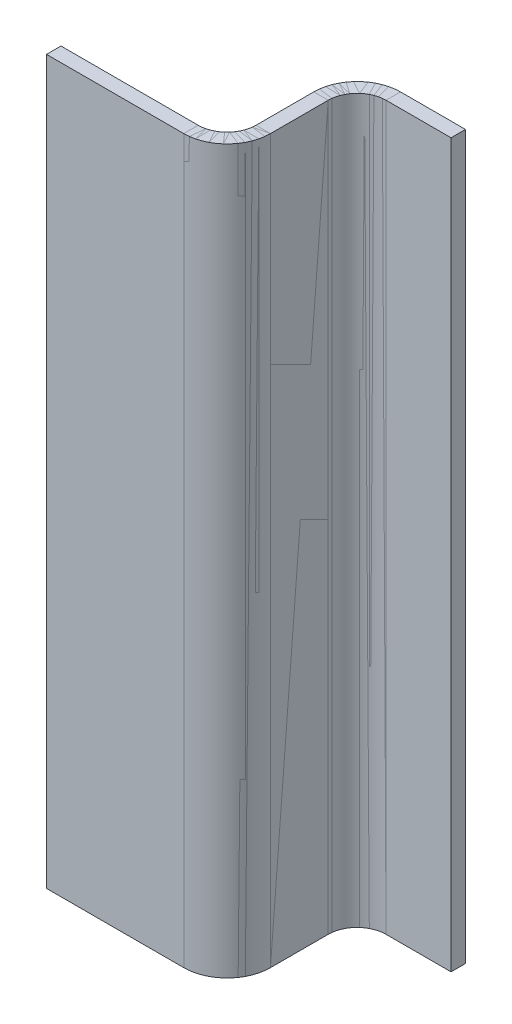
ISO-10303-21;
HEADER;
FILE_DESCRIPTION(('STEP AP214'),'2;1');
FILE_NAME('part.step','',(''),(''),'','','');
FILE_SCHEMA(('AUTOMOTIVE_DESIGN { 1 0 10303 214 1 1 1 1 }'));
ENDSEC;
DATA;
#1=APPLICATION_CONTEXT('core data for automotive mechanical design processes');
#2=APPLICATION_PROTOCOL_DEFINITION('international standard','automotive_design',2000,#1);
#3=PRODUCT_CONTEXT('',#1,'mechanical');
#4=PRODUCT('Part','Part','',(#3));
#5=PRODUCT_RELATED_PRODUCT_CATEGORY('part','',(#4));
#6=PRODUCT_DEFINITION_FORMATION('','',#4);
#7=PRODUCT_DEFINITION_CONTEXT('part definition',#1,'design');
#8=PRODUCT_DEFINITION('design','',#6,#7);
#9=PRODUCT_DEFINITION_SHAPE('','',#8);
#10=(LENGTH_UNIT() NAMED_UNIT(*) SI_UNIT(.MILLI.,.METRE.));
#11=(NAMED_UNIT(*) PLANE_ANGLE_UNIT() SI_UNIT($,.RADIAN.));
#12=(NAMED_UNIT(*) SI_UNIT($,.STERADIAN.) SOLID_ANGLE_UNIT());
#13=UNCERTAINTY_MEASURE_WITH_UNIT(LENGTH_MEASURE(1.E-05),#10,'distance_accuracy_value','');
#14=(GEOMETRIC_REPRESENTATION_CONTEXT(3) GLOBAL_UNCERTAINTY_ASSIGNED_CONTEXT((#13)) GLOBAL_UNIT_ASSIGNED_CONTEXT((#10,
#11,#12)) REPRESENTATION_CONTEXT('',''));
#15=CARTESIAN_POINT('',(0.,0.,0.));
#16=DIRECTION('',(0.,0.,1.));
#17=DIRECTION('',(1.,0.,0.));
#18=AXIS2_PLACEMENT_3D('',#15,#16,#17);
#19=CARTESIAN_POINT('',(19.,49.9999999999999,-5.));
#20=DIRECTION('',(0.,-1.,0.));
#21=DIRECTION('',(0.,0.,-1.));
#22=AXIS2_PLACEMENT_3D('',#19,#20,#21);
#23=PLANE('',#22);
#24=DIRECTION('',(1.,0.,0.));
#25=VECTOR('',#24,1.);
#26=CARTESIAN_POINT('',(25.,49.9999999999999,-5.00000000000002));
#27=LINE('',#26,#25);
#28=CARTESIAN_POINT('',(23.,49.9999999999999,-5.00000000000001));
#29=VERTEX_POINT('',#28);
#30=CARTESIAN_POINT('',(25.,49.9999999999999,-5.00000000000002));
#31=VERTEX_POINT('',#30);
#32=EDGE_CURVE('E12',#29,#31,#27,.T.);
#33=ORIENTED_EDGE('',*,*,#32,.F.);
#34=CARTESIAN_POINT('',(19.,49.9999999999999,-5.));
#35=DIRECTION('',(0.,1.,0.));
#36=DIRECTION('',(0.,0.,1.));
#37=AXIS2_PLACEMENT_3D('',#34,#35,#36);
#38=CIRCLE('',#37,4.);
#39=CARTESIAN_POINT('',(19.,49.9999999999999,-0.999999999999996));
#40=VERTEX_POINT('',#39);
#41=EDGE_CURVE('E176',#40,#29,#38,.T.);
#42=ORIENTED_EDGE('',*,*,#41,.F.);
#43=DIRECTION('',(0.,0.,1.));
#44=VECTOR('',#43,1.);
#45=CARTESIAN_POINT('',(19.,49.9999999999999,1.));
#46=LINE('',#45,#44);
#47=CARTESIAN_POINT('',(19.,49.9999999999999,1.));
#48=VERTEX_POINT('',#47);
#49=EDGE_CURVE('E65',#40,#48,#46,.T.);
#50=ORIENTED_EDGE('',*,*,#49,.T.);
#51=CARTESIAN_POINT('',(19.,49.9999999999999,-5.));
#52=DIRECTION('',(0.,1.,0.));
#53=DIRECTION('',(0.,0.,1.));
#54=AXIS2_PLACEMENT_3D('',#51,#52,#53);
#55=CIRCLE('',#54,6.);
#56=EDGE_CURVE('E213',#48,#31,#55,.T.);
#57=ORIENTED_EDGE('',*,*,#56,.T.);
#58=EDGE_LOOP('',(#33,#42,#50,#57));
#59=FACE_BOUND('',#58,.T.);
#60=ADVANCED_FACE('F55',(#59),#23,.F.);
#61=CARTESIAN_POINT('',(0.,49.9999999999999,1.));
#62=DIRECTION('',(0.,-1.,0.));
#63=DIRECTION('',(1.,0.,0.));
#64=AXIS2_PLACEMENT_3D('',#61,#62,#63);
#65=PLANE('',#64);
#66=ORIENTED_EDGE('',*,*,#49,.F.);
#67=DIRECTION('',(1.,0.,0.));
#68=VECTOR('',#67,1.);
#69=CARTESIAN_POINT('',(0.,49.9999999999999,-0.999999999999995));
#70=LINE('',#69,#68);
#71=CARTESIAN_POINT('',(0.,49.9999999999999,-0.999999999999995));
#72=VERTEX_POINT('',#71);
#73=EDGE_CURVE('E183',#72,#40,#70,.T.);
#74=ORIENTED_EDGE('',*,*,#73,.F.);
#75=DIRECTION('',(0.,0.,1.));
#76=VECTOR('',#75,1.);
#77=CARTESIAN_POINT('',(0.,49.9999999999999,1.));
#78=LINE('',#77,#76);
#79=CARTESIAN_POINT('',(0.,49.9999999999999,1.));
#80=VERTEX_POINT('',#79);
#81=EDGE_CURVE('E206',#72,#80,#78,.T.);
#82=ORIENTED_EDGE('',*,*,#81,.T.);
#83=DIRECTION('',(1.,0.,0.));
#84=VECTOR('',#83,1.);
#85=CARTESIAN_POINT('',(0.,49.9999999999999,1.));
#86=LINE('',#85,#84);
#87=EDGE_CURVE('E235',#80,#48,#86,.T.);
#88=ORIENTED_EDGE('',*,*,#87,.T.);
#89=EDGE_LOOP('',(#66,#74,#82,#88));
#90=FACE_BOUND('',#89,.T.);
#91=ADVANCED_FACE('F236',(#90),#65,.F.);
#92=CARTESIAN_POINT('',(0.,-50.0000000000001,1.00000000000001));
#93=DIRECTION('',(-1.,0.,0.));
#94=DIRECTION('',(0.,-1.,0.));
#95=AXIS2_PLACEMENT_3D('',#92,#93,#94);
#96=PLANE('',#95);
#97=ORIENTED_EDGE('',*,*,#81,.F.);
#98=DIRECTION('',(0.,1.,0.));
#99=VECTOR('',#98,1.);
#100=CARTESIAN_POINT('',(0.,-50.0000000000001,-0.999999999999991));
#101=LINE('',#100,#99);
#102=CARTESIAN_POINT('',(0.,-50.0000000000001,-0.999999999999991));
#103=VERTEX_POINT('',#102);
#104=EDGE_CURVE('E180',#72,#103,#101,.F.);
#105=ORIENTED_EDGE('',*,*,#104,.T.);
#106=DIRECTION('',(0.,0.,1.));
#107=VECTOR('',#106,1.);
#108=CARTESIAN_POINT('',(0.,-50.0000000000001,1.00000000000001));
#109=LINE('',#108,#107);
#110=CARTESIAN_POINT('',(0.,-50.0000000000001,1.00000000000001));
#111=VERTEX_POINT('',#110);
#112=EDGE_CURVE('E203',#103,#111,#109,.T.);
#113=ORIENTED_EDGE('',*,*,#112,.T.);
#114=DIRECTION('',(0.,-1.,0.));
#115=VECTOR('',#114,1.);
#116=CARTESIAN_POINT('',(0.,-50.0000000000001,1.00000000000001));
#117=LINE('',#116,#115);
#118=EDGE_CURVE('E240',#80,#111,#117,.T.);
#119=ORIENTED_EDGE('',*,*,#118,.F.);
#120=EDGE_LOOP('',(#97,#105,#113,#119));
#121=FACE_BOUND('',#120,.T.);
#122=ADVANCED_FACE('F284',(#121),#96,.T.);
#123=CARTESIAN_POINT('',(0.,-50.0000000000001,1.00000000000001));
#124=DIRECTION('',(0.,-1.,0.));
#125=DIRECTION('',(1.,0.,0.));
#126=AXIS2_PLACEMENT_3D('',#123,#124,#125);
#127=PLANE('',#126);
#128=ORIENTED_EDGE('',*,*,#112,.F.);
#129=DIRECTION('',(1.,0.,0.));
#130=VECTOR('',#129,1.);
#131=CARTESIAN_POINT('',(0.,-50.0000000000001,-0.999999999999991));
#132=LINE('',#131,#130);
#133=CARTESIAN_POINT('',(19.,-50.0000000000001,-0.999999999999993));
#134=VERTEX_POINT('',#133);
#135=EDGE_CURVE('E177',#103,#134,#132,.T.);
#136=ORIENTED_EDGE('',*,*,#135,.T.);
#137=DIRECTION('',(0.,0.,1.));
#138=VECTOR('',#137,1.);
#139=CARTESIAN_POINT('',(19.,-50.0000000000001,1.));
#140=LINE('',#139,#138);
#141=CARTESIAN_POINT('',(19.,-50.0000000000001,1.));
#142=VERTEX_POINT('',#141);
#143=EDGE_CURVE('E200',#134,#142,#140,.T.);
#144=ORIENTED_EDGE('',*,*,#143,.T.);
#145=DIRECTION('',(1.,0.,0.));
#146=VECTOR('',#145,1.);
#147=CARTESIAN_POINT('',(0.,-50.0000000000001,1.00000000000001));
#148=LINE('',#147,#146);
#149=EDGE_CURVE('E232',#111,#142,#148,.T.);
#150=ORIENTED_EDGE('',*,*,#149,.F.);
#151=EDGE_LOOP('',(#128,#136,#144,#150));
#152=FACE_BOUND('',#151,.T.);
#153=ADVANCED_FACE('F288',(#152),#127,.T.);
#154=CARTESIAN_POINT('',(19.,-50.0000000000001,-5.));
#155=DIRECTION('',(0.,-1.,0.));
#156=DIRECTION('',(0.,0.,-1.));
#157=AXIS2_PLACEMENT_3D('',#154,#155,#156);
#158=PLANE('',#157);
#159=ORIENTED_EDGE('',*,*,#143,.F.);
#160=CARTESIAN_POINT('',(19.,-50.0000000000001,-5.));
#161=DIRECTION('',(0.,1.,0.));
#162=DIRECTION('',(0.,0.,1.));
#163=AXIS2_PLACEMENT_3D('',#160,#161,#162);
#164=CIRCLE('',#163,4.);
#165=CARTESIAN_POINT('',(23.,-50.0000000000001,-5.00000000000001));
#166=VERTEX_POINT('',#165);
#167=EDGE_CURVE('E170',#134,#166,#164,.T.);
#168=ORIENTED_EDGE('',*,*,#167,.T.);
#169=DIRECTION('',(1.,0.,0.));
#170=VECTOR('',#169,1.);
#171=CARTESIAN_POINT('',(25.,-50.0000000000001,-5.00000000000002));
#172=LINE('',#171,#170);
#173=CARTESIAN_POINT('',(25.,-50.0000000000001,-5.00000000000002));
#174=VERTEX_POINT('',#173);
#175=EDGE_CURVE('E197',#166,#174,#172,.T.);
#176=ORIENTED_EDGE('',*,*,#175,.T.);
#177=CARTESIAN_POINT('',(19.,-50.0000000000001,-5.));
#178=DIRECTION('',(0.,1.,0.));
#179=DIRECTION('',(0.,0.,1.));
#180=AXIS2_PLACEMENT_3D('',#177,#178,#179);
#181=CIRCLE('',#180,6.);
#182=EDGE_CURVE('E231',#142,#174,#181,.T.);
#183=ORIENTED_EDGE('',*,*,#182,.F.);
#184=EDGE_LOOP('',(#159,#168,#176,#183));
#185=FACE_BOUND('',#184,.T.);
#186=ADVANCED_FACE('F275',(#185),#158,.T.);
#187=CARTESIAN_POINT('',(25.,-50.0000000000001,-5.00000000000002));
#188=DIRECTION('',(0.,-1.,0.));
#189=DIRECTION('',(0.,0.,-1.));
#190=AXIS2_PLACEMENT_3D('',#187,#188,#189);
#191=PLANE('',#190);
#192=ORIENTED_EDGE('',*,*,#175,.F.);
#193=DIRECTION('',(0.,0.,-1.));
#194=VECTOR('',#193,1.);
#195=CARTESIAN_POINT('',(23.,-50.0000000000001,-5.00000000000001));
#196=LINE('',#195,#194);
#197=CARTESIAN_POINT('',(23.,-50.0000000000001,-13.));
#198=VERTEX_POINT('',#197);
#199=EDGE_CURVE('E172',#166,#198,#196,.T.);
#200=ORIENTED_EDGE('',*,*,#199,.T.);
#201=DIRECTION('',(1.,0.,0.));
#202=VECTOR('',#201,1.);
#203=CARTESIAN_POINT('',(25.,-50.0000000000001,-13.));
#204=LINE('',#203,#202);
#205=CARTESIAN_POINT('',(25.,-50.0000000000001,-13.));
#206=VERTEX_POINT('',#205);
#207=EDGE_CURVE('E194',#198,#206,#204,.T.);
#208=ORIENTED_EDGE('',*,*,#207,.T.);
#209=DIRECTION('',(0.,0.,-1.));
#210=VECTOR('',#209,1.);
#211=CARTESIAN_POINT('',(25.,-50.0000000000001,-5.00000000000002));
#212=LINE('',#211,#210);
#213=EDGE_CURVE('E246',#174,#206,#212,.T.);
#214=ORIENTED_EDGE('',*,*,#213,.F.);
#215=EDGE_LOOP('',(#192,#200,#208,#214));
#216=FACE_BOUND('',#215,.T.);
#217=ADVANCED_FACE('F295',(#216),#191,.T.);
#218=CARTESIAN_POINT('',(29.,-50.0000000000001,-13.));
#219=DIRECTION('',(0.,1.,0.));
#220=DIRECTION('',(0.,0.,1.));
#221=AXIS2_PLACEMENT_3D('',#218,#219,#220);
#222=PLANE('',#221);
#223=ORIENTED_EDGE('',*,*,#207,.F.);
#224=CARTESIAN_POINT('',(29.,-50.0000000000001,-13.));
#225=DIRECTION('',(0.,-1.,0.));
#226=DIRECTION('',(0.,0.,-1.));
#227=AXIS2_PLACEMENT_3D('',#224,#225,#226);
#228=CIRCLE('',#227,6.);
#229=CARTESIAN_POINT('',(29.,-50.0000000000001,-19.));
#230=VERTEX_POINT('',#229);
#231=EDGE_CURVE('E142',#198,#230,#228,.T.);
#232=ORIENTED_EDGE('',*,*,#231,.T.);
#233=DIRECTION('',(0.,0.,1.));
#234=VECTOR('',#233,1.);
#235=CARTESIAN_POINT('',(29.,-50.0000000000001,-17.));
#236=LINE('',#235,#234);
#237=CARTESIAN_POINT('',(29.,-50.0000000000001,-17.));
#238=VERTEX_POINT('',#237);
#239=EDGE_CURVE('E192',#230,#238,#236,.T.);
#240=ORIENTED_EDGE('',*,*,#239,.T.);
#241=CARTESIAN_POINT('',(29.,-50.0000000000001,-13.));
#242=DIRECTION('',(0.,-1.,0.));
#243=DIRECTION('',(-1.,0.,0.));
#244=AXIS2_PLACEMENT_3D('',#241,#242,#243);
#245=CIRCLE('',#244,4.);
#246=EDGE_CURVE('E131',#206,#238,#245,.T.);
#247=ORIENTED_EDGE('',*,*,#246,.F.);
#248=EDGE_LOOP('',(#223,#232,#240,#247));
#249=FACE_BOUND('',#248,.T.);
#250=ADVANCED_FACE('F337',(#249),#222,.F.);
#251=CARTESIAN_POINT('',(29.,-50.0000000000001,-17.));
#252=DIRECTION('',(0.,-1.,0.));
#253=DIRECTION('',(1.,0.,0.));
#254=AXIS2_PLACEMENT_3D('',#251,#252,#253);
#255=PLANE('',#254);
#256=ORIENTED_EDGE('',*,*,#239,.F.);
#257=DIRECTION('',(1.,0.,0.));
#258=VECTOR('',#257,1.);
#259=CARTESIAN_POINT('',(29.,-50.0000000000001,-19.));
#260=LINE('',#259,#258);
#261=CARTESIAN_POINT('',(37.9999999999999,-50.0000000000001,-19.));
#262=VERTEX_POINT('',#261);
#263=EDGE_CURVE('E155',#230,#262,#260,.T.);
#264=ORIENTED_EDGE('',*,*,#263,.T.);
#265=DIRECTION('',(0.,0.,1.));
#266=VECTOR('',#265,1.);
#267=CARTESIAN_POINT('',(37.9999999999999,-50.0000000000001,-17.));
#268=LINE('',#267,#266);
#269=CARTESIAN_POINT('',(37.9999999999999,-50.0000000000001,-17.));
#270=VERTEX_POINT('',#269);
#271=EDGE_CURVE('E73',#262,#270,#268,.T.);
#272=ORIENTED_EDGE('',*,*,#271,.T.);
#273=DIRECTION('',(1.,0.,0.));
#274=VECTOR('',#273,1.);
#275=CARTESIAN_POINT('',(29.,-50.0000000000001,-17.));
#276=LINE('',#275,#274);
#277=EDGE_CURVE('E264',#238,#270,#276,.T.);
#278=ORIENTED_EDGE('',*,*,#277,.F.);
#279=EDGE_LOOP('',(#256,#264,#272,#278));
#280=FACE_BOUND('',#279,.T.);
#281=ADVANCED_FACE('F348',(#280),#255,.T.);
#282=CARTESIAN_POINT('',(37.9999999999999,-50.0000000000001,-17.));
#283=DIRECTION('',(-1.,0.,0.));
#284=DIRECTION('',(0.,-1.,0.));
#285=AXIS2_PLACEMENT_3D('',#282,#283,#284);
#286=PLANE('',#285);
#287=ORIENTED_EDGE('',*,*,#271,.F.);
#288=DIRECTION('',(0.,1.,0.));
#289=VECTOR('',#288,1.);
#290=CARTESIAN_POINT('',(37.9999999999999,-50.0000000000001,-19.));
#291=LINE('',#290,#289);
#292=CARTESIAN_POINT('',(37.9999999999999,49.9999999999999,-19.));
#293=VERTEX_POINT('',#292);
#294=EDGE_CURVE('E168',#293,#262,#291,.F.);
#295=ORIENTED_EDGE('',*,*,#294,.F.);
#296=DIRECTION('',(0.,0.,1.));
#297=VECTOR('',#296,1.);
#298=CARTESIAN_POINT('',(37.9999999999999,49.9999999999999,-17.));
#299=LINE('',#298,#297);
#300=CARTESIAN_POINT('',(37.9999999999999,49.9999999999999,-17.));
#301=VERTEX_POINT('',#300);
#302=EDGE_CURVE('E188',#293,#301,#299,.T.);
#303=ORIENTED_EDGE('',*,*,#302,.T.);
#304=DIRECTION('',(0.,-1.,0.));
#305=VECTOR('',#304,1.);
#306=CARTESIAN_POINT('',(37.9999999999999,-50.0000000000001,-17.));
#307=LINE('',#306,#305);
#308=EDGE_CURVE('E255',#301,#270,#307,.T.);
#309=ORIENTED_EDGE('',*,*,#308,.T.);
#310=EDGE_LOOP('',(#287,#295,#303,#309));
#311=FACE_BOUND('',#310,.T.);
#312=ADVANCED_FACE('F359',(#311),#286,.F.);
#313=CARTESIAN_POINT('',(29.,49.9999999999999,-17.));
#314=DIRECTION('',(0.,-1.,0.));
#315=DIRECTION('',(1.,0.,0.));
#316=AXIS2_PLACEMENT_3D('',#313,#314,#315);
#317=PLANE('',#316);
#318=ORIENTED_EDGE('',*,*,#302,.F.);
#319=DIRECTION('',(1.,0.,0.));
#320=VECTOR('',#319,1.);
#321=CARTESIAN_POINT('',(29.,49.9999999999999,-19.));
#322=LINE('',#321,#320);
#323=CARTESIAN_POINT('',(29.,49.9999999999999,-19.));
#324=VERTEX_POINT('',#323);
#325=EDGE_CURVE('E165',#324,#293,#322,.T.);
#326=ORIENTED_EDGE('',*,*,#325,.F.);
#327=DIRECTION('',(0.,0.,1.));
#328=VECTOR('',#327,1.);
#329=CARTESIAN_POINT('',(29.,49.9999999999999,-17.));
#330=LINE('',#329,#328);
#331=CARTESIAN_POINT('',(29.,49.9999999999999,-17.));
#332=VERTEX_POINT('',#331);
#333=EDGE_CURVE('E130',#324,#332,#330,.T.);
#334=ORIENTED_EDGE('',*,*,#333,.T.);
#335=DIRECTION('',(1.,0.,0.));
#336=VECTOR('',#335,1.);
#337=CARTESIAN_POINT('',(29.,49.9999999999999,-17.));
#338=LINE('',#337,#336);
#339=EDGE_CURVE('E258',#332,#301,#338,.T.);
#340=ORIENTED_EDGE('',*,*,#339,.T.);
#341=EDGE_LOOP('',(#318,#326,#334,#340));
#342=FACE_BOUND('',#341,.T.);
#343=ADVANCED_FACE('F370',(#342),#317,.F.);
#344=CARTESIAN_POINT('',(29.,49.9999999999999,-13.));
#345=DIRECTION('',(0.,1.,0.));
#346=DIRECTION('',(0.,0.,1.));
#347=AXIS2_PLACEMENT_3D('',#344,#345,#346);
#348=PLANE('',#347);
#349=ORIENTED_EDGE('',*,*,#333,.F.);
#350=CARTESIAN_POINT('',(29.,49.9999999999999,-13.));
#351=DIRECTION('',(0.,-1.,0.));
#352=DIRECTION('',(0.,0.,-1.));
#353=AXIS2_PLACEMENT_3D('',#350,#351,#352);
#354=CIRCLE('',#353,6.);
#355=CARTESIAN_POINT('',(23.,49.9999999999999,-13.));
#356=VERTEX_POINT('',#355);
#357=EDGE_CURVE('E139',#356,#324,#354,.T.);
#358=ORIENTED_EDGE('',*,*,#357,.F.);
#359=DIRECTION('',(1.,0.,0.));
#360=VECTOR('',#359,1.);
#361=CARTESIAN_POINT('',(25.,49.9999999999999,-13.));
#362=LINE('',#361,#360);
#363=CARTESIAN_POINT('',(25.,49.9999999999999,-13.));
#364=VERTEX_POINT('',#363);
#365=EDGE_CURVE('E59',#356,#364,#362,.T.);
#366=ORIENTED_EDGE('',*,*,#365,.T.);
#367=CARTESIAN_POINT('',(29.,49.9999999999999,-13.));
#368=DIRECTION('',(0.,-1.,0.));
#369=DIRECTION('',(-1.,0.,0.));
#370=AXIS2_PLACEMENT_3D('',#367,#368,#369);
#371=CIRCLE('',#370,4.);
#372=EDGE_CURVE('E266',#364,#332,#371,.T.);
#373=ORIENTED_EDGE('',*,*,#372,.T.);
#374=EDGE_LOOP('',(#349,#358,#366,#373));
#375=FACE_BOUND('',#374,.T.);
#376=ADVANCED_FACE('F152',(#375),#348,.T.);
#377=CARTESIAN_POINT('',(25.,49.9999999999999,-5.00000000000002));
#378=DIRECTION('',(0.,-1.,0.));
#379=DIRECTION('',(0.,0.,-1.));
#380=AXIS2_PLACEMENT_3D('',#377,#378,#379);
#381=PLANE('',#380);
#382=DIRECTION('',(0.,0.,-1.));
#383=VECTOR('',#382,1.);
#384=CARTESIAN_POINT('',(23.,49.9999999999999,-5.00000000000001));
#385=LINE('',#384,#383);
#386=EDGE_CURVE('E122',#29,#356,#385,.T.);
#387=ORIENTED_EDGE('',*,*,#386,.F.);
#388=ORIENTED_EDGE('',*,*,#32,.T.);
#389=DIRECTION('',(0.,0.,-1.));
#390=VECTOR('',#389,1.);
#391=CARTESIAN_POINT('',(25.,49.9999999999999,-5.00000000000002));
#392=LINE('',#391,#390);
#393=EDGE_CURVE('E124',#31,#364,#392,.T.);
#394=ORIENTED_EDGE('',*,*,#393,.T.);
#395=ORIENTED_EDGE('',*,*,#365,.F.);
#396=EDGE_LOOP('',(#387,#388,#394,#395));
#397=FACE_BOUND('',#396,.T.);
#398=ADVANCED_FACE('F57',(#397),#381,.F.);
#399=CARTESIAN_POINT('',(29.,0.,-13.));
#400=DIRECTION('',(0.,-1.,0.));
#401=DIRECTION('',(0.,0.,-1.));
#402=AXIS2_PLACEMENT_3D('',#399,#400,#401);
#403=CYLINDRICAL_SURFACE('',#402,4.);
#404=DIRECTION('',(0.,-1.,0.));
#405=VECTOR('',#404,1.);
#406=CARTESIAN_POINT('',(29.,-50.0000000000001,-17.));
#407=LINE('',#406,#405);
#408=EDGE_CURVE('E261',#332,#238,#407,.T.);
#409=ORIENTED_EDGE('',*,*,#408,.F.);
#410=ORIENTED_EDGE('',*,*,#372,.F.);
#411=DIRECTION('',(0.,-1.,0.));
#412=VECTOR('',#411,1.);
#413=CARTESIAN_POINT('',(25.,-50.0000000000001,-13.));
#414=LINE('',#413,#412);
#415=EDGE_CURVE('E157',#364,#206,#414,.T.);
#416=ORIENTED_EDGE('',*,*,#415,.T.);
#417=ORIENTED_EDGE('',*,*,#246,.T.);
#418=EDGE_LOOP('',(#409,#410,#416,#417));
#419=FACE_BOUND('',#418,.T.);
#420=ADVANCED_FACE('F401',(#419),#403,.F.);
#421=CARTESIAN_POINT('',(29.,-50.0000000000001,-17.));
#422=DIRECTION('',(0.,0.,1.));
#423=DIRECTION('',(1.,0.,0.));
#424=AXIS2_PLACEMENT_3D('',#421,#422,#423);
#425=PLANE('',#424);
#426=ORIENTED_EDGE('',*,*,#308,.F.);
#427=ORIENTED_EDGE('',*,*,#339,.F.);
#428=ORIENTED_EDGE('',*,*,#408,.T.);
#429=ORIENTED_EDGE('',*,*,#277,.T.);
#430=EDGE_LOOP('',(#426,#427,#428,#429));
#431=FACE_BOUND('',#430,.T.);
#432=ADVANCED_FACE('F411',(#431),#425,.T.);
#433=CARTESIAN_POINT('',(19.,0.,-5.));
#434=DIRECTION('',(0.,1.,0.));
#435=DIRECTION('',(0.,0.,1.));
#436=AXIS2_PLACEMENT_3D('',#433,#434,#435);
#437=CYLINDRICAL_SURFACE('',#436,6.);
#438=DIRECTION('',(0.,-1.,0.));
#439=VECTOR('',#438,1.);
#440=CARTESIAN_POINT('',(25.,-50.0000000000001,-5.00000000000002));
#441=LINE('',#440,#439);
#442=EDGE_CURVE('E230',#31,#174,#441,.T.);
#443=ORIENTED_EDGE('',*,*,#442,.F.);
#444=ORIENTED_EDGE('',*,*,#56,.F.);
#445=DIRECTION('',(0.,-1.,0.));
#446=VECTOR('',#445,1.);
#447=CARTESIAN_POINT('',(19.,-50.0000000000001,1.));
#448=LINE('',#447,#446);
#449=EDGE_CURVE('E228',#48,#142,#448,.T.);
#450=ORIENTED_EDGE('',*,*,#449,.T.);
#451=ORIENTED_EDGE('',*,*,#182,.T.);
#452=EDGE_LOOP('',(#443,#444,#450,#451));
#453=FACE_BOUND('',#452,.T.);
#454=ADVANCED_FACE('F224',(#453),#437,.T.);
#455=CARTESIAN_POINT('',(0.,-50.0000000000001,1.00000000000001));
#456=DIRECTION('',(0.,0.,1.));
#457=DIRECTION('',(1.,0.,0.));
#458=AXIS2_PLACEMENT_3D('',#455,#456,#457);
#459=PLANE('',#458);
#460=ORIENTED_EDGE('',*,*,#449,.F.);
#461=ORIENTED_EDGE('',*,*,#87,.F.);
#462=ORIENTED_EDGE('',*,*,#118,.T.);
#463=ORIENTED_EDGE('',*,*,#149,.T.);
#464=EDGE_LOOP('',(#460,#461,#462,#463));
#465=FACE_BOUND('',#464,.T.);
#466=ADVANCED_FACE('F243',(#465),#459,.T.);
#467=CARTESIAN_POINT('',(25.,-50.0000000000001,-5.00000000000002));
#468=DIRECTION('',(1.,0.,0.));
#469=DIRECTION('',(0.,0.,-1.));
#470=AXIS2_PLACEMENT_3D('',#467,#468,#469);
#471=PLANE('',#470);
#472=ORIENTED_EDGE('',*,*,#415,.F.);
#473=ORIENTED_EDGE('',*,*,#393,.F.);
#474=ORIENTED_EDGE('',*,*,#442,.T.);
#475=ORIENTED_EDGE('',*,*,#213,.T.);
#476=EDGE_LOOP('',(#472,#473,#474,#475));
#477=FACE_BOUND('',#476,.T.);
#478=ADVANCED_FACE('F444',(#477),#471,.T.);
#479=CARTESIAN_POINT('',(29.,0.,-13.));
#480=DIRECTION('',(0.,-1.,0.));
#481=DIRECTION('',(0.,0.,-1.));
#482=AXIS2_PLACEMENT_3D('',#479,#480,#481);
#483=CYLINDRICAL_SURFACE('',#482,6.);
#484=DIRECTION('',(0.,1.,0.));
#485=VECTOR('',#484,1.);
#486=CARTESIAN_POINT('',(29.,-50.0000000000001,-19.));
#487=LINE('',#486,#485);
#488=EDGE_CURVE('E159',#324,#230,#487,.F.);
#489=ORIENTED_EDGE('',*,*,#488,.T.);
#490=ORIENTED_EDGE('',*,*,#231,.F.);
#491=DIRECTION('',(0.,-1.,0.));
#492=VECTOR('',#491,1.);
#493=CARTESIAN_POINT('',(23.,0.,-13.));
#494=LINE('',#493,#492);
#495=EDGE_CURVE('E136',#356,#198,#494,.T.);
#496=ORIENTED_EDGE('',*,*,#495,.F.);
#497=ORIENTED_EDGE('',*,*,#357,.T.);
#498=EDGE_LOOP('',(#489,#490,#496,#497));
#499=FACE_BOUND('',#498,.T.);
#500=ADVANCED_FACE('F138',(#499),#483,.T.);
#501=CARTESIAN_POINT('',(29.,-50.0000000000001,-19.));
#502=DIRECTION('',(0.,0.,1.));
#503=DIRECTION('',(1.,0.,0.));
#504=AXIS2_PLACEMENT_3D('',#501,#502,#503);
#505=PLANE('',#504);
#506=ORIENTED_EDGE('',*,*,#294,.T.);
#507=ORIENTED_EDGE('',*,*,#263,.F.);
#508=ORIENTED_EDGE('',*,*,#488,.F.);
#509=ORIENTED_EDGE('',*,*,#325,.T.);
#510=EDGE_LOOP('',(#506,#507,#508,#509));
#511=FACE_BOUND('',#510,.T.);
#512=ADVANCED_FACE('F464',(#511),#505,.F.);
#513=CARTESIAN_POINT('',(19.,0.,-5.));
#514=DIRECTION('',(0.,1.,0.));
#515=DIRECTION('',(0.,0.,1.));
#516=AXIS2_PLACEMENT_3D('',#513,#514,#515);
#517=CYLINDRICAL_SURFACE('',#516,4.);
#518=DIRECTION('',(0.,1.,0.));
#519=VECTOR('',#518,1.);
#520=CARTESIAN_POINT('',(23.,-50.0000000000001,-5.00000000000001));
#521=LINE('',#520,#519);
#522=EDGE_CURVE('E149',#29,#166,#521,.F.);
#523=ORIENTED_EDGE('',*,*,#522,.T.);
#524=ORIENTED_EDGE('',*,*,#167,.F.);
#525=DIRECTION('',(0.,1.,0.));
#526=VECTOR('',#525,1.);
#527=CARTESIAN_POINT('',(19.,0.,-0.999999999999994));
#528=LINE('',#527,#526);
#529=EDGE_CURVE('E163',#40,#134,#528,.F.);
#530=ORIENTED_EDGE('',*,*,#529,.F.);
#531=ORIENTED_EDGE('',*,*,#41,.T.);
#532=EDGE_LOOP('',(#523,#524,#530,#531));
#533=FACE_BOUND('',#532,.T.);
#534=ADVANCED_FACE('F272',(#533),#517,.F.);
#535=CARTESIAN_POINT('',(0.,-50.0000000000001,-0.999999999999991));
#536=DIRECTION('',(0.,0.,1.));
#537=DIRECTION('',(1.,0.,0.));
#538=AXIS2_PLACEMENT_3D('',#535,#536,#537);
#539=PLANE('',#538);
#540=ORIENTED_EDGE('',*,*,#529,.T.);
#541=ORIENTED_EDGE('',*,*,#135,.F.);
#542=ORIENTED_EDGE('',*,*,#104,.F.);
#543=ORIENTED_EDGE('',*,*,#73,.T.);
#544=EDGE_LOOP('',(#540,#541,#542,#543));
#545=FACE_BOUND('',#544,.T.);
#546=ADVANCED_FACE('F281',(#545),#539,.F.);
#547=CARTESIAN_POINT('',(23.,-50.0000000000001,-5.00000000000001));
#548=DIRECTION('',(1.,0.,0.));
#549=DIRECTION('',(0.,0.,-1.));
#550=AXIS2_PLACEMENT_3D('',#547,#548,#549);
#551=PLANE('',#550);
#552=ORIENTED_EDGE('',*,*,#495,.T.);
#553=ORIENTED_EDGE('',*,*,#199,.F.);
#554=ORIENTED_EDGE('',*,*,#522,.F.);
#555=ORIENTED_EDGE('',*,*,#386,.T.);
#556=EDGE_LOOP('',(#552,#553,#554,#555));
#557=FACE_BOUND('',#556,.T.);
#558=ADVANCED_FACE('F147',(#557),#551,.F.);
#559=CLOSED_SHELL('',(#60,#91,#122,#153,#186,#217,#250,#281,#312,#343,#376,#398,#420,#432,#454,
#466,#478,#500,#512,#534,#546,#558));
#560=MANIFOLD_SOLID_BREP('B2',#559);
#561=CARTESIAN_POINT('',(0.,0.,0.));
#562=DIRECTION('',(1.,0.,0.));
#563=DIRECTION('',(0.,0.,-1.));
#564=AXIS2_PLACEMENT_3D('',#561,#562,#563);
#565=PLANE('',#564);
#566=DIRECTION('',(0.,0.,1.));
#567=VECTOR('',#566,1.);
#568=CARTESIAN_POINT('',(0.,49.9999999999999,1.));
#569=LINE('',#568,#567);
#570=CARTESIAN_POINT('',(0.,49.9999999999999,-0.999999999999999));
#571=VERTEX_POINT('',#570);
#572=CARTESIAN_POINT('',(0.,49.9999999999999,1.));
#573=VERTEX_POINT('',#572);
#574=EDGE_CURVE('E696',#571,#573,#569,.T.);
#575=ORIENTED_EDGE('',*,*,#574,.F.);
#576=DIRECTION('',(0.,1.,0.));
#577=VECTOR('',#576,1.);
#578=CARTESIAN_POINT('',(0.,-50.0000000000001,-0.999999999999998));
#579=LINE('',#578,#577);
#580=CARTESIAN_POINT('',(0.,-50.0000000000001,-0.999999999999998));
#581=VERTEX_POINT('',#580);
#582=EDGE_CURVE('E681',#581,#571,#579,.T.);
#583=ORIENTED_EDGE('',*,*,#582,.F.);
#584=DIRECTION('',(0.,0.,-1.));
#585=VECTOR('',#584,1.);
#586=CARTESIAN_POINT('',(0.,-50.0000000000001,1.));
#587=LINE('',#586,#585);
#588=CARTESIAN_POINT('',(0.,-50.0000000000001,1.));
#589=VERTEX_POINT('',#588);
#590=EDGE_CURVE('E676',#589,#581,#587,.T.);
#591=ORIENTED_EDGE('',*,*,#590,.F.);
#592=DIRECTION('',(0.,-1.,0.));
#593=VECTOR('',#592,1.);
#594=CARTESIAN_POINT('',(0.,-50.0000000000001,1.));
#595=LINE('',#594,#593);
#596=EDGE_CURVE('E678',#573,#589,#595,.T.);
#597=ORIENTED_EDGE('',*,*,#596,.F.);
#598=EDGE_LOOP('',(#575,#583,#591,#597));
#599=FACE_BOUND('',#598,.T.);
#600=ADVANCED_FACE('F567',(#599),#565,.F.);
#601=CARTESIAN_POINT('',(37.9999999999999,0.,-18.));
#602=DIRECTION('',(1.,0.,0.));
#603=DIRECTION('',(0.,0.,-1.));
#604=AXIS2_PLACEMENT_3D('',#601,#602,#603);
#605=PLANE('',#604);
#606=DIRECTION('',(0.,0.,1.));
#607=VECTOR('',#606,1.);
#608=CARTESIAN_POINT('',(37.9999999999999,49.9999999999999,-17.));
#609=LINE('',#608,#607);
#610=CARTESIAN_POINT('',(37.9999999999999,49.9999999999999,-19.));
#611=VERTEX_POINT('',#610);
#612=CARTESIAN_POINT('',(37.9999999999999,49.9999999999999,-17.));
#613=VERTEX_POINT('',#612);
#614=EDGE_CURVE('E581',#611,#613,#609,.T.);
#615=ORIENTED_EDGE('',*,*,#614,.T.);
#616=DIRECTION('',(0.,-1.,0.));
#617=VECTOR('',#616,1.);
#618=CARTESIAN_POINT('',(37.9999999999999,-50.0000000000001,-17.));
#619=LINE('',#618,#617);
#620=CARTESIAN_POINT('',(37.9999999999999,-50.0000000000001,-17.));
#621=VERTEX_POINT('',#620);
#622=EDGE_CURVE('E53',#613,#621,#619,.T.);
#623=ORIENTED_EDGE('',*,*,#622,.T.);
#624=DIRECTION('',(0.,0.,-1.));
#625=VECTOR('',#624,1.);
#626=CARTESIAN_POINT('',(37.9999999999999,-50.0000000000001,-17.));
#627=LINE('',#626,#625);
#628=CARTESIAN_POINT('',(37.9999999999999,-50.0000000000001,-19.));
#629=VERTEX_POINT('',#628);
#630=EDGE_CURVE('E743',#621,#629,#627,.T.);
#631=ORIENTED_EDGE('',*,*,#630,.T.);
#632=DIRECTION('',(0.,1.,0.));
#633=VECTOR('',#632,1.);
#634=CARTESIAN_POINT('',(37.9999999999999,-50.0000000000001,-19.));
#635=LINE('',#634,#633);
#636=EDGE_CURVE('E587',#629,#611,#635,.T.);
#637=ORIENTED_EDGE('',*,*,#636,.T.);
#638=EDGE_LOOP('',(#615,#623,#631,#637));
#639=FACE_BOUND('',#638,.T.);
#640=ADVANCED_FACE('F839',(#639),#605,.T.);
#641=CARTESIAN_POINT('',(0.,-50.0000000000001,1.));
#642=DIRECTION('',(0.,-1.,0.));
#643=DIRECTION('',(0.,0.,-1.));
#644=AXIS2_PLACEMENT_3D('',#641,#642,#643);
#645=PLANE('',#644);
#646=DIRECTION('',(1.,0.,0.));
#647=VECTOR('',#646,1.);
#648=CARTESIAN_POINT('',(0.,-50.0000000000001,-0.999999999999998));
#649=LINE('',#648,#647);
#650=CARTESIAN_POINT('',(19.,-50.0000000000001,-0.999999999999999));
#651=VERTEX_POINT('',#650);
#652=EDGE_CURVE('E705',#581,#651,#649,.T.);
#653=ORIENTED_EDGE('',*,*,#652,.T.);
#654=DIRECTION('',(0.,0.,-1.));
#655=VECTOR('',#654,1.);
#656=CARTESIAN_POINT('',(19.,-50.0000000000001,1.));
#657=LINE('',#656,#655);
#658=CARTESIAN_POINT('',(19.,-50.0000000000001,1.));
#659=VERTEX_POINT('',#658);
#660=EDGE_CURVE('E701',#659,#651,#657,.T.);
#661=ORIENTED_EDGE('',*,*,#660,.F.);
#662=DIRECTION('',(1.,0.,0.));
#663=VECTOR('',#662,1.);
#664=CARTESIAN_POINT('',(0.,-50.0000000000001,1.));
#665=LINE('',#664,#663);
#666=EDGE_CURVE('E692',#589,#659,#665,.T.);
#667=ORIENTED_EDGE('',*,*,#666,.F.);
#668=ORIENTED_EDGE('',*,*,#590,.T.);
#669=EDGE_LOOP('',(#653,#661,#667,#668));
#670=FACE_BOUND('',#669,.T.);
#671=ADVANCED_FACE('F699',(#670),#645,.T.);
#672=CARTESIAN_POINT('',(0.,-50.0000000000001,-0.999999999999998));
#673=DIRECTION('',(0.,0.,-1.));
#674=DIRECTION('',(-1.,0.,0.));
#675=AXIS2_PLACEMENT_3D('',#672,#673,#674);
#676=PLANE('',#675);
#677=DIRECTION('',(1.,0.,0.));
#678=VECTOR('',#677,1.);
#679=CARTESIAN_POINT('',(0.,49.9999999999999,-0.999999999999999));
#680=LINE('',#679,#678);
#681=CARTESIAN_POINT('',(19.,49.9999999999999,-0.999999999999999));
#682=VERTEX_POINT('',#681);
#683=EDGE_CURVE('E755',#571,#682,#680,.T.);
#684=ORIENTED_EDGE('',*,*,#683,.T.);
#685=DIRECTION('',(0.,1.,0.));
#686=VECTOR('',#685,1.);
#687=CARTESIAN_POINT('',(19.,-50.0000000000001,-0.999999999999999));
#688=LINE('',#687,#686);
#689=EDGE_CURVE('E752',#651,#682,#688,.T.);
#690=ORIENTED_EDGE('',*,*,#689,.F.);
#691=ORIENTED_EDGE('',*,*,#652,.F.);
#692=ORIENTED_EDGE('',*,*,#582,.T.);
#693=EDGE_LOOP('',(#684,#690,#691,#692));
#694=FACE_BOUND('',#693,.T.);
#695=ADVANCED_FACE('F869',(#694),#676,.T.);
#696=CARTESIAN_POINT('',(0.,49.9999999999999,1.));
#697=DIRECTION('',(0.,1.,0.));
#698=DIRECTION('',(0.,0.,1.));
#699=AXIS2_PLACEMENT_3D('',#696,#697,#698);
#700=PLANE('',#699);
#701=DIRECTION('',(1.,0.,0.));
#702=VECTOR('',#701,1.);
#703=CARTESIAN_POINT('',(0.,49.9999999999999,1.));
#704=LINE('',#703,#702);
#705=CARTESIAN_POINT('',(19.,49.9999999999999,1.));
#706=VERTEX_POINT('',#705);
#707=EDGE_CURVE('E694',#573,#706,#704,.T.);
#708=ORIENTED_EDGE('',*,*,#707,.T.);
#709=DIRECTION('',(0.,0.,1.));
#710=VECTOR('',#709,1.);
#711=CARTESIAN_POINT('',(19.,49.9999999999999,1.));
#712=LINE('',#711,#710);
#713=EDGE_CURVE('E758',#682,#706,#712,.T.);
#714=ORIENTED_EDGE('',*,*,#713,.F.);
#715=ORIENTED_EDGE('',*,*,#683,.F.);
#716=ORIENTED_EDGE('',*,*,#574,.T.);
#717=EDGE_LOOP('',(#708,#714,#715,#716));
#718=FACE_BOUND('',#717,.T.);
#719=ADVANCED_FACE('F824',(#718),#700,.T.);
#720=CARTESIAN_POINT('',(0.,-50.0000000000001,1.));
#721=DIRECTION('',(0.,0.,1.));
#722=DIRECTION('',(1.,0.,0.));
#723=AXIS2_PLACEMENT_3D('',#720,#721,#722);
#724=PLANE('',#723);
#725=DIRECTION('',(0.,-1.,0.));
#726=VECTOR('',#725,1.);
#727=CARTESIAN_POINT('',(19.,-50.0000000000001,1.));
#728=LINE('',#727,#726);
#729=EDGE_CURVE('E720',#706,#659,#728,.T.);
#730=ORIENTED_EDGE('',*,*,#729,.F.);
#731=ORIENTED_EDGE('',*,*,#707,.F.);
#732=ORIENTED_EDGE('',*,*,#596,.T.);
#733=ORIENTED_EDGE('',*,*,#666,.T.);
#734=EDGE_LOOP('',(#730,#731,#732,#733));
#735=FACE_BOUND('',#734,.T.);
#736=ADVANCED_FACE('F691',(#735),#724,.T.);
#737=CARTESIAN_POINT('',(19.,-50.0000000000001,1.));
#738=DIRECTION('',(0.,-1.,0.));
#739=DIRECTION('',(0.,0.,-1.));
#740=AXIS2_PLACEMENT_3D('',#737,#738,#739);
#741=PLANE('',#740);
#742=CARTESIAN_POINT('',(19.,-50.0000000000001,-5.));
#743=DIRECTION('',(0.,1.,0.));
#744=DIRECTION('',(0.,0.,1.));
#745=AXIS2_PLACEMENT_3D('',#742,#743,#744);
#746=CIRCLE('',#745,4.);
#747=CARTESIAN_POINT('',(23.,-50.0000000000001,-5.00000000000002));
#748=VERTEX_POINT('',#747);
#749=EDGE_CURVE('E712',#651,#748,#746,.T.);
#750=ORIENTED_EDGE('',*,*,#749,.T.);
#751=DIRECTION('',(-1.,0.,0.));
#752=VECTOR('',#751,1.);
#753=CARTESIAN_POINT('',(25.,-50.0000000000001,-5.00000000000002));
#754=LINE('',#753,#752);
#755=CARTESIAN_POINT('',(25.,-50.0000000000001,-5.00000000000002));
#756=VERTEX_POINT('',#755);
#757=EDGE_CURVE('E709',#756,#748,#754,.T.);
#758=ORIENTED_EDGE('',*,*,#757,.F.);
#759=CARTESIAN_POINT('',(19.,-50.0000000000001,-5.));
#760=DIRECTION('',(0.,1.,0.));
#761=DIRECTION('',(0.,0.,1.));
#762=AXIS2_PLACEMENT_3D('',#759,#760,#761);
#763=CIRCLE('',#762,6.);
#764=EDGE_CURVE('E713',#659,#756,#763,.T.);
#765=ORIENTED_EDGE('',*,*,#764,.F.);
#766=ORIENTED_EDGE('',*,*,#660,.T.);
#767=EDGE_LOOP('',(#750,#758,#765,#766));
#768=FACE_BOUND('',#767,.T.);
#769=ADVANCED_FACE('F820',(#768),#741,.T.);
#770=CARTESIAN_POINT('',(19.,0.,-5.));
#771=DIRECTION('',(0.,1.,0.));
#772=DIRECTION('',(0.,0.,1.));
#773=AXIS2_PLACEMENT_3D('',#770,#771,#772);
#774=CYLINDRICAL_SURFACE('',#773,4.);
#775=CARTESIAN_POINT('',(19.,49.9999999999999,-5.));
#776=DIRECTION('',(0.,1.,0.));
#777=DIRECTION('',(0.,0.,1.));
#778=AXIS2_PLACEMENT_3D('',#775,#776,#777);
#779=CIRCLE('',#778,4.);
#780=CARTESIAN_POINT('',(23.,49.9999999999999,-5.00000000000002));
#781=VERTEX_POINT('',#780);
#782=EDGE_CURVE('E761',#682,#781,#779,.T.);
#783=ORIENTED_EDGE('',*,*,#782,.T.);
#784=DIRECTION('',(0.,1.,0.));
#785=VECTOR('',#784,1.);
#786=CARTESIAN_POINT('',(23.,-50.0000000000001,-5.00000000000002));
#787=LINE('',#786,#785);
#788=EDGE_CURVE('E716',#748,#781,#787,.T.);
#789=ORIENTED_EDGE('',*,*,#788,.F.);
#790=ORIENTED_EDGE('',*,*,#749,.F.);
#791=ORIENTED_EDGE('',*,*,#689,.T.);
#792=EDGE_LOOP('',(#783,#789,#790,#791));
#793=FACE_BOUND('',#792,.T.);
#794=ADVANCED_FACE('F831',(#793),#774,.F.);
#795=CARTESIAN_POINT('',(19.,49.9999999999999,1.));
#796=DIRECTION('',(0.,1.,0.));
#797=DIRECTION('',(0.,0.,1.));
#798=AXIS2_PLACEMENT_3D('',#795,#796,#797);
#799=PLANE('',#798);
#800=CARTESIAN_POINT('',(19.,49.9999999999999,-5.));
#801=DIRECTION('',(0.,1.,0.));
#802=DIRECTION('',(0.,0.,1.));
#803=AXIS2_PLACEMENT_3D('',#800,#801,#802);
#804=CIRCLE('',#803,6.);
#805=CARTESIAN_POINT('',(25.,49.9999999999999,-5.00000000000002));
#806=VERTEX_POINT('',#805);
#807=EDGE_CURVE('E782',#706,#806,#804,.T.);
#808=ORIENTED_EDGE('',*,*,#807,.T.);
#809=DIRECTION('',(1.,0.,0.));
#810=VECTOR('',#809,1.);
#811=CARTESIAN_POINT('',(25.,49.9999999999999,-5.00000000000002));
#812=LINE('',#811,#810);
#813=EDGE_CURVE('E764',#781,#806,#812,.T.);
#814=ORIENTED_EDGE('',*,*,#813,.F.);
#815=ORIENTED_EDGE('',*,*,#782,.F.);
#816=ORIENTED_EDGE('',*,*,#713,.T.);
#817=EDGE_LOOP('',(#808,#814,#815,#816));
#818=FACE_BOUND('',#817,.T.);
#819=ADVANCED_FACE('F827',(#818),#799,.T.);
#820=CARTESIAN_POINT('',(19.,0.,-5.));
#821=DIRECTION('',(0.,1.,0.));
#822=DIRECTION('',(0.,0.,1.));
#823=AXIS2_PLACEMENT_3D('',#820,#821,#822);
#824=CYLINDRICAL_SURFACE('',#823,6.);
#825=DIRECTION('',(0.,-1.,0.));
#826=VECTOR('',#825,1.);
#827=CARTESIAN_POINT('',(25.,-50.0000000000001,-5.00000000000002));
#828=LINE('',#827,#826);
#829=EDGE_CURVE('E732',#806,#756,#828,.T.);
#830=ORIENTED_EDGE('',*,*,#829,.F.);
#831=ORIENTED_EDGE('',*,*,#807,.F.);
#832=ORIENTED_EDGE('',*,*,#729,.T.);
#833=ORIENTED_EDGE('',*,*,#764,.T.);
#834=EDGE_LOOP('',(#830,#831,#832,#833));
#835=FACE_BOUND('',#834,.T.);
#836=ADVANCED_FACE('F821',(#835),#824,.T.);
#837=CARTESIAN_POINT('',(25.,-50.0000000000001,-5.00000000000002));
#838=DIRECTION('',(0.,-1.,0.));
#839=DIRECTION('',(0.,0.,-1.));
#840=AXIS2_PLACEMENT_3D('',#837,#838,#839);
#841=PLANE('',#840);
#842=DIRECTION('',(0.,0.,-1.));
#843=VECTOR('',#842,1.);
#844=CARTESIAN_POINT('',(23.,-50.0000000000001,-5.00000000000001));
#845=LINE('',#844,#843);
#846=CARTESIAN_POINT('',(23.,-50.0000000000001,-13.));
#847=VERTEX_POINT('',#846);
#848=EDGE_CURVE('E724',#748,#847,#845,.T.);
#849=ORIENTED_EDGE('',*,*,#848,.T.);
#850=DIRECTION('',(-1.,0.,0.));
#851=VECTOR('',#850,1.);
#852=CARTESIAN_POINT('',(25.,-50.0000000000001,-13.));
#853=LINE('',#852,#851);
#854=CARTESIAN_POINT('',(25.,-50.0000000000001,-13.));
#855=VERTEX_POINT('',#854);
#856=EDGE_CURVE('E721',#855,#847,#853,.T.);
#857=ORIENTED_EDGE('',*,*,#856,.F.);
#858=DIRECTION('',(0.,0.,-1.));
#859=VECTOR('',#858,1.);
#860=CARTESIAN_POINT('',(25.,-50.0000000000001,-5.00000000000002));
#861=LINE('',#860,#859);
#862=EDGE_CURVE('E725',#756,#855,#861,.T.);
#863=ORIENTED_EDGE('',*,*,#862,.F.);
#864=ORIENTED_EDGE('',*,*,#757,.T.);
#865=EDGE_LOOP('',(#849,#857,#863,#864));
#866=FACE_BOUND('',#865,.T.);
#867=ADVANCED_FACE('F814',(#866),#841,.T.);
#868=CARTESIAN_POINT('',(23.,-50.0000000000001,-5.00000000000001));
#869=DIRECTION('',(-1.,0.,0.));
#870=DIRECTION('',(0.,0.,1.));
#871=AXIS2_PLACEMENT_3D('',#868,#869,#870);
#872=PLANE('',#871);
#873=DIRECTION('',(0.,0.,-1.));
#874=VECTOR('',#873,1.);
#875=CARTESIAN_POINT('',(23.,49.9999999999999,-5.00000000000001));
#876=LINE('',#875,#874);
#877=CARTESIAN_POINT('',(23.,49.9999999999999,-13.));
#878=VERTEX_POINT('',#877);
#879=EDGE_CURVE('E766',#781,#878,#876,.T.);
#880=ORIENTED_EDGE('',*,*,#879,.T.);
#881=DIRECTION('',(0.,1.,0.));
#882=VECTOR('',#881,1.);
#883=CARTESIAN_POINT('',(23.,-50.0000000000001,-13.));
#884=LINE('',#883,#882);
#885=EDGE_CURVE('E728',#847,#878,#884,.T.);
#886=ORIENTED_EDGE('',*,*,#885,.F.);
#887=ORIENTED_EDGE('',*,*,#848,.F.);
#888=ORIENTED_EDGE('',*,*,#788,.T.);
#889=EDGE_LOOP('',(#880,#886,#887,#888));
#890=FACE_BOUND('',#889,.T.);
#891=ADVANCED_FACE('F834',(#890),#872,.T.);
#892=CARTESIAN_POINT('',(25.,49.9999999999999,-5.00000000000002));
#893=DIRECTION('',(0.,1.,0.));
#894=DIRECTION('',(0.,0.,1.));
#895=AXIS2_PLACEMENT_3D('',#892,#893,#894);
#896=PLANE('',#895);
#897=DIRECTION('',(0.,0.,-1.));
#898=VECTOR('',#897,1.);
#899=CARTESIAN_POINT('',(25.,49.9999999999999,-5.00000000000002));
#900=LINE('',#899,#898);
#901=CARTESIAN_POINT('',(25.,49.9999999999999,-13.));
#902=VERTEX_POINT('',#901);
#903=EDGE_CURVE('E786',#806,#902,#900,.T.);
#904=ORIENTED_EDGE('',*,*,#903,.T.);
#905=DIRECTION('',(1.,0.,0.));
#906=VECTOR('',#905,1.);
#907=CARTESIAN_POINT('',(25.,49.9999999999999,-13.));
#908=LINE('',#907,#906);
#909=EDGE_CURVE('E769',#878,#902,#908,.T.);
#910=ORIENTED_EDGE('',*,*,#909,.F.);
#911=ORIENTED_EDGE('',*,*,#879,.F.);
#912=ORIENTED_EDGE('',*,*,#813,.T.);
#913=EDGE_LOOP('',(#904,#910,#911,#912));
#914=FACE_BOUND('',#913,.T.);
#915=ADVANCED_FACE('F843',(#914),#896,.T.);
#916=CARTESIAN_POINT('',(25.,-50.0000000000001,-5.00000000000002));
#917=DIRECTION('',(1.,0.,0.));
#918=DIRECTION('',(0.,0.,-1.));
#919=AXIS2_PLACEMENT_3D('',#916,#917,#918);
#920=PLANE('',#919);
#921=DIRECTION('',(0.,-1.,0.));
#922=VECTOR('',#921,1.);
#923=CARTESIAN_POINT('',(25.,-50.0000000000001,-13.));
#924=LINE('',#923,#922);
#925=EDGE_CURVE('E742',#902,#855,#924,.T.);
#926=ORIENTED_EDGE('',*,*,#925,.F.);
#927=ORIENTED_EDGE('',*,*,#903,.F.);
#928=ORIENTED_EDGE('',*,*,#829,.T.);
#929=ORIENTED_EDGE('',*,*,#862,.T.);
#930=EDGE_LOOP('',(#926,#927,#928,#929));
#931=FACE_BOUND('',#930,.T.);
#932=ADVANCED_FACE('F815',(#931),#920,.T.);
#933=CARTESIAN_POINT('',(25.,-50.0000000000001,-13.));
#934=DIRECTION('',(0.,-1.,0.));
#935=DIRECTION('',(0.,0.,-1.));
#936=AXIS2_PLACEMENT_3D('',#933,#934,#935);
#937=PLANE('',#936);
#938=CARTESIAN_POINT('',(29.,-50.0000000000001,-13.));
#939=DIRECTION('',(0.,-1.,0.));
#940=DIRECTION('',(-1.,0.,0.));
#941=AXIS2_PLACEMENT_3D('',#938,#939,#940);
#942=CIRCLE('',#941,6.);
#943=CARTESIAN_POINT('',(29.,-50.0000000000001,-19.));
#944=VERTEX_POINT('',#943);
#945=EDGE_CURVE('E657',#847,#944,#942,.T.);
#946=ORIENTED_EDGE('',*,*,#945,.T.);
#947=DIRECTION('',(0.,0.,-1.));
#948=VECTOR('',#947,1.);
#949=CARTESIAN_POINT('',(29.,-50.0000000000001,-17.));
#950=LINE('',#949,#948);
#951=CARTESIAN_POINT('',(29.,-50.0000000000001,-17.));
#952=VERTEX_POINT('',#951);
#953=EDGE_CURVE('E733',#952,#944,#950,.T.);
#954=ORIENTED_EDGE('',*,*,#953,.F.);
#955=CARTESIAN_POINT('',(29.,-50.0000000000001,-13.));
#956=DIRECTION('',(0.,-1.,0.));
#957=DIRECTION('',(-1.,0.,0.));
#958=AXIS2_PLACEMENT_3D('',#955,#956,#957);
#959=CIRCLE('',#958,4.);
#960=EDGE_CURVE('E736',#855,#952,#959,.T.);
#961=ORIENTED_EDGE('',*,*,#960,.F.);
#962=ORIENTED_EDGE('',*,*,#856,.T.);
#963=EDGE_LOOP('',(#946,#954,#961,#962));
#964=FACE_BOUND('',#963,.T.);
#965=ADVANCED_FACE('F807',(#964),#937,.T.);
#966=CARTESIAN_POINT('',(29.,0.,-13.));
#967=DIRECTION('',(0.,-1.,0.));
#968=DIRECTION('',(0.,0.,-1.));
#969=AXIS2_PLACEMENT_3D('',#966,#967,#968);
#970=CYLINDRICAL_SURFACE('',#969,6.);
#971=CARTESIAN_POINT('',(29.,49.9999999999999,-13.));
#972=DIRECTION('',(0.,-1.,0.));
#973=DIRECTION('',(-1.,0.,0.));
#974=AXIS2_PLACEMENT_3D('',#971,#972,#973);
#975=CIRCLE('',#974,6.);
#976=CARTESIAN_POINT('',(29.,49.9999999999999,-19.));
#977=VERTEX_POINT('',#976);
#978=EDGE_CURVE('E651',#878,#977,#975,.T.);
#979=ORIENTED_EDGE('',*,*,#978,.T.);
#980=DIRECTION('',(0.,1.,0.));
#981=VECTOR('',#980,1.);
#982=CARTESIAN_POINT('',(29.,-50.0000000000001,-19.));
#983=LINE('',#982,#981);
#984=EDGE_CURVE('E738',#944,#977,#983,.T.);
#985=ORIENTED_EDGE('',*,*,#984,.F.);
#986=ORIENTED_EDGE('',*,*,#945,.F.);
#987=ORIENTED_EDGE('',*,*,#885,.T.);
#988=EDGE_LOOP('',(#979,#985,#986,#987));
#989=FACE_BOUND('',#988,.T.);
#990=ADVANCED_FACE('F835',(#989),#970,.T.);
#991=CARTESIAN_POINT('',(25.,49.9999999999999,-13.));
#992=DIRECTION('',(0.,1.,0.));
#993=DIRECTION('',(0.,0.,1.));
#994=AXIS2_PLACEMENT_3D('',#991,#992,#993);
#995=PLANE('',#994);
#996=CARTESIAN_POINT('',(29.,49.9999999999999,-13.));
#997=DIRECTION('',(0.,-1.,0.));
#998=DIRECTION('',(-1.,0.,0.));
#999=AXIS2_PLACEMENT_3D('',#996,#997,#998);
#1000=CIRCLE('',#999,4.);
#1001=CARTESIAN_POINT('',(29.,49.9999999999999,-17.));
#1002=VERTEX_POINT('',#1001);
#1003=EDGE_CURVE('E791',#902,#1002,#1000,.T.);
#1004=ORIENTED_EDGE('',*,*,#1003,.T.);
#1005=DIRECTION('',(0.,0.,1.));
#1006=VECTOR('',#1005,1.);
#1007=CARTESIAN_POINT('',(29.,49.9999999999999,-17.));
#1008=LINE('',#1007,#1006);
#1009=EDGE_CURVE('E772',#977,#1002,#1008,.T.);
#1010=ORIENTED_EDGE('',*,*,#1009,.F.);
#1011=ORIENTED_EDGE('',*,*,#978,.F.);
#1012=ORIENTED_EDGE('',*,*,#909,.T.);
#1013=EDGE_LOOP('',(#1004,#1010,#1011,#1012));
#1014=FACE_BOUND('',#1013,.T.);
#1015=ADVANCED_FACE('F841',(#1014),#995,.T.);
#1016=CARTESIAN_POINT('',(29.,0.,-13.));
#1017=DIRECTION('',(0.,-1.,0.));
#1018=DIRECTION('',(0.,0.,-1.));
#1019=AXIS2_PLACEMENT_3D('',#1016,#1017,#1018);
#1020=CYLINDRICAL_SURFACE('',#1019,4.);
#1021=DIRECTION('',(0.,-1.,0.));
#1022=VECTOR('',#1021,1.);
#1023=CARTESIAN_POINT('',(29.,-50.0000000000001,-17.));
#1024=LINE('',#1023,#1022);
#1025=EDGE_CURVE('E750',#1002,#952,#1024,.T.);
#1026=ORIENTED_EDGE('',*,*,#1025,.F.);
#1027=ORIENTED_EDGE('',*,*,#1003,.F.);
#1028=ORIENTED_EDGE('',*,*,#925,.T.);
#1029=ORIENTED_EDGE('',*,*,#960,.T.);
#1030=EDGE_LOOP('',(#1026,#1027,#1028,#1029));
#1031=FACE_BOUND('',#1030,.T.);
#1032=ADVANCED_FACE('F809',(#1031),#1020,.F.);
#1033=CARTESIAN_POINT('',(29.,-50.0000000000001,-17.));
#1034=DIRECTION('',(0.,-1.,0.));
#1035=DIRECTION('',(0.,0.,-1.));
#1036=AXIS2_PLACEMENT_3D('',#1033,#1034,#1035);
#1037=PLANE('',#1036);
#1038=DIRECTION('',(1.,0.,0.));
#1039=VECTOR('',#1038,1.);
#1040=CARTESIAN_POINT('',(29.,-50.0000000000001,-19.));
#1041=LINE('',#1040,#1039);
#1042=EDGE_CURVE('E632',#944,#629,#1041,.T.);
#1043=ORIENTED_EDGE('',*,*,#1042,.T.);
#1044=ORIENTED_EDGE('',*,*,#630,.F.);
#1045=DIRECTION('',(1.,0.,0.));
#1046=VECTOR('',#1045,1.);
#1047=CARTESIAN_POINT('',(29.,-50.0000000000001,-17.));
#1048=LINE('',#1047,#1046);
#1049=EDGE_CURVE('E745',#952,#621,#1048,.T.);
#1050=ORIENTED_EDGE('',*,*,#1049,.F.);
#1051=ORIENTED_EDGE('',*,*,#953,.T.);
#1052=EDGE_LOOP('',(#1043,#1044,#1050,#1051));
#1053=FACE_BOUND('',#1052,.T.);
#1054=ADVANCED_FACE('F838',(#1053),#1037,.T.);
#1055=CARTESIAN_POINT('',(29.,-50.0000000000001,-19.));
#1056=DIRECTION('',(0.,0.,-1.));
#1057=DIRECTION('',(-1.,0.,0.));
#1058=AXIS2_PLACEMENT_3D('',#1055,#1056,#1057);
#1059=PLANE('',#1058);
#1060=DIRECTION('',(1.,0.,0.));
#1061=VECTOR('',#1060,1.);
#1062=CARTESIAN_POINT('',(29.,49.9999999999999,-19.));
#1063=LINE('',#1062,#1061);
#1064=EDGE_CURVE('E625',#977,#611,#1063,.T.);
#1065=ORIENTED_EDGE('',*,*,#1064,.T.);
#1066=ORIENTED_EDGE('',*,*,#636,.F.);
#1067=ORIENTED_EDGE('',*,*,#1042,.F.);
#1068=ORIENTED_EDGE('',*,*,#984,.T.);
#1069=EDGE_LOOP('',(#1065,#1066,#1067,#1068));
#1070=FACE_BOUND('',#1069,.T.);
#1071=ADVANCED_FACE('F836',(#1070),#1059,.T.);
#1072=CARTESIAN_POINT('',(29.,49.9999999999999,-17.));
#1073=DIRECTION('',(0.,1.,0.));
#1074=DIRECTION('',(0.,0.,1.));
#1075=AXIS2_PLACEMENT_3D('',#1072,#1073,#1074);
#1076=PLANE('',#1075);
#1077=DIRECTION('',(1.,0.,0.));
#1078=VECTOR('',#1077,1.);
#1079=CARTESIAN_POINT('',(29.,49.9999999999999,-17.));
#1080=LINE('',#1079,#1078);
#1081=EDGE_CURVE('E575',#1002,#613,#1080,.T.);
#1082=ORIENTED_EDGE('',*,*,#1081,.T.);
#1083=ORIENTED_EDGE('',*,*,#614,.F.);
#1084=ORIENTED_EDGE('',*,*,#1064,.F.);
#1085=ORIENTED_EDGE('',*,*,#1009,.T.);
#1086=EDGE_LOOP('',(#1082,#1083,#1084,#1085));
#1087=FACE_BOUND('',#1086,.T.);
#1088=ADVANCED_FACE('F840',(#1087),#1076,.T.);
#1089=CARTESIAN_POINT('',(29.,-50.0000000000001,-17.));
#1090=DIRECTION('',(0.,0.,1.));
#1091=DIRECTION('',(1.,0.,0.));
#1092=AXIS2_PLACEMENT_3D('',#1089,#1090,#1091);
#1093=PLANE('',#1092);
#1094=ORIENTED_EDGE('',*,*,#622,.F.);
#1095=ORIENTED_EDGE('',*,*,#1081,.F.);
#1096=ORIENTED_EDGE('',*,*,#1025,.T.);
#1097=ORIENTED_EDGE('',*,*,#1049,.T.);
#1098=EDGE_LOOP('',(#1094,#1095,#1096,#1097));
#1099=FACE_BOUND('',#1098,.T.);
#1100=ADVANCED_FACE('F804',(#1099),#1093,.T.);
#1101=CLOSED_SHELL('',(#600,#640,#671,#695,#719,#736,#769,#794,#819,#836,#867,#891,#915,#932,
#965,#990,#1015,#1032,#1054,#1071,#1088,#1100));
#1102=MANIFOLD_SOLID_BREP('B6',#1101);
#1103=ADVANCED_BREP_SHAPE_REPRESENTATION('',(#18,#560,#1102),#14);
#1104=SHAPE_DEFINITION_REPRESENTATION(#9,#1103);
ENDSEC;
END-ISO-10303-21;
